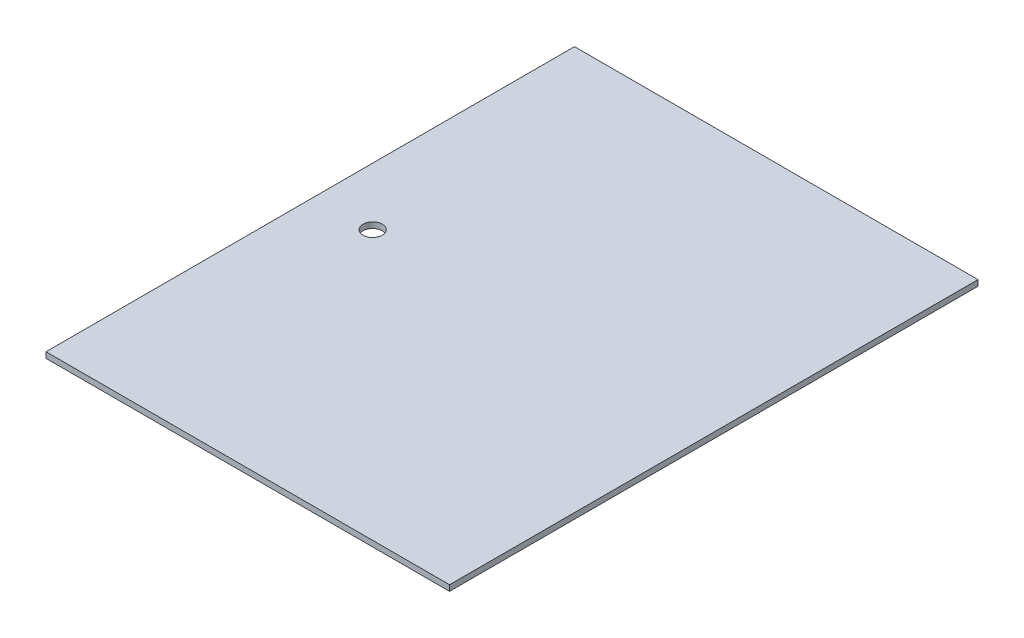
ISO-10303-21;
HEADER;
FILE_DESCRIPTION(('STEP AP214'),'2;1');
FILE_NAME('part.step','',(''),(''),'','','');
FILE_SCHEMA(('AUTOMOTIVE_DESIGN { 1 0 10303 214 1 1 1 1 }'));
ENDSEC;
DATA;
#1=APPLICATION_CONTEXT('core data for automotive mechanical design processes');
#2=APPLICATION_PROTOCOL_DEFINITION('international standard','automotive_design',2000,#1);
#3=PRODUCT_CONTEXT('',#1,'mechanical');
#4=PRODUCT('Part','Part','',(#3));
#5=PRODUCT_RELATED_PRODUCT_CATEGORY('part','',(#4));
#6=PRODUCT_DEFINITION_FORMATION('','',#4);
#7=PRODUCT_DEFINITION_CONTEXT('part definition',#1,'design');
#8=PRODUCT_DEFINITION('design','',#6,#7);
#9=PRODUCT_DEFINITION_SHAPE('','',#8);
#10=(LENGTH_UNIT() NAMED_UNIT(*) SI_UNIT(.MILLI.,.METRE.));
#11=(NAMED_UNIT(*) PLANE_ANGLE_UNIT() SI_UNIT($,.RADIAN.));
#12=(NAMED_UNIT(*) SI_UNIT($,.STERADIAN.) SOLID_ANGLE_UNIT());
#13=UNCERTAINTY_MEASURE_WITH_UNIT(LENGTH_MEASURE(1.E-05),#10,'distance_accuracy_value','');
#14=(GEOMETRIC_REPRESENTATION_CONTEXT(3) GLOBAL_UNCERTAINTY_ASSIGNED_CONTEXT((#13)) GLOBAL_UNIT_ASSIGNED_CONTEXT((#10,
#11,#12)) REPRESENTATION_CONTEXT('',''));
#15=CARTESIAN_POINT('',(0.,0.,0.));
#16=DIRECTION('',(0.,0.,1.));
#17=DIRECTION('',(1.,0.,0.));
#18=AXIS2_PLACEMENT_3D('',#15,#16,#17);
#19=CARTESIAN_POINT('',(-74.7122316133509,3.,-199.478610643544));
#20=DIRECTION('',(1.,0.,0.));
#21=DIRECTION('',(0.,0.,-1.));
#22=AXIS2_PLACEMENT_3D('',#19,#20,#21);
#23=PLANE('',#22);
#24=DIRECTION('',(0.,0.,1.));
#25=VECTOR('',#24,1.);
#26=CARTESIAN_POINT('',(-74.7122316133509,0.,-199.478610643544));
#27=LINE('',#26,#25);
#28=CARTESIAN_POINT('',(-74.7122316133509,0.,-199.478610643544));
#29=VERTEX_POINT('',#28);
#30=CARTESIAN_POINT('',(-74.7122316133508,0.,75.5213893564557));
#31=VERTEX_POINT('',#30);
#32=EDGE_CURVE('E96',#29,#31,#27,.T.);
#33=ORIENTED_EDGE('',*,*,#32,.T.);
#34=DIRECTION('',(0.,-1.,0.));
#35=VECTOR('',#34,1.);
#36=CARTESIAN_POINT('',(-74.7122316133508,3.,75.5213893564557));
#37=LINE('',#36,#35);
#38=CARTESIAN_POINT('',(-74.7122316133508,3.,75.5213893564557));
#39=VERTEX_POINT('',#38);
#40=EDGE_CURVE('E11',#39,#31,#37,.T.);
#41=ORIENTED_EDGE('',*,*,#40,.F.);
#42=DIRECTION('',(0.,0.,1.));
#43=VECTOR('',#42,1.);
#44=CARTESIAN_POINT('',(-74.7122316133509,3.,-199.478610643544));
#45=LINE('',#44,#43);
#46=CARTESIAN_POINT('',(-74.7122316133509,3.,-199.478610643544));
#47=VERTEX_POINT('',#46);
#48=EDGE_CURVE('E84',#47,#39,#45,.T.);
#49=ORIENTED_EDGE('',*,*,#48,.F.);
#50=DIRECTION('',(0.,-1.,0.));
#51=VECTOR('',#50,1.);
#52=CARTESIAN_POINT('',(-74.7122316133509,3.,-199.478610643544));
#53=LINE('',#52,#51);
#54=EDGE_CURVE('E92',#47,#29,#53,.T.);
#55=ORIENTED_EDGE('',*,*,#54,.T.);
#56=EDGE_LOOP('',(#33,#41,#49,#55));
#57=FACE_BOUND('',#56,.T.);
#58=ADVANCED_FACE('F33',(#57),#23,.F.);
#59=CARTESIAN_POINT('',(-74.7122316133508,3.,75.5213893564557));
#60=DIRECTION('',(0.,0.,-1.));
#61=DIRECTION('',(-1.,0.,0.));
#62=AXIS2_PLACEMENT_3D('',#59,#60,#61);
#63=PLANE('',#62);
#64=DIRECTION('',(1.,0.,0.));
#65=VECTOR('',#64,1.);
#66=CARTESIAN_POINT('',(-74.7122316133508,0.,75.5213893564557));
#67=LINE('',#66,#65);
#68=CARTESIAN_POINT('',(135.287768386649,0.,75.5213893564557));
#69=VERTEX_POINT('',#68);
#70=EDGE_CURVE('E88',#31,#69,#67,.T.);
#71=ORIENTED_EDGE('',*,*,#70,.T.);
#72=DIRECTION('',(0.,-1.,0.));
#73=VECTOR('',#72,1.);
#74=CARTESIAN_POINT('',(135.287768386649,3.,75.5213893564557));
#75=LINE('',#74,#73);
#76=CARTESIAN_POINT('',(135.287768386649,3.,75.5213893564557));
#77=VERTEX_POINT('',#76);
#78=EDGE_CURVE('E41',#77,#69,#75,.T.);
#79=ORIENTED_EDGE('',*,*,#78,.F.);
#80=DIRECTION('',(1.,0.,0.));
#81=VECTOR('',#80,1.);
#82=CARTESIAN_POINT('',(-74.7122316133508,3.,75.5213893564557));
#83=LINE('',#82,#81);
#84=EDGE_CURVE('E79',#39,#77,#83,.T.);
#85=ORIENTED_EDGE('',*,*,#84,.F.);
#86=ORIENTED_EDGE('',*,*,#40,.T.);
#87=EDGE_LOOP('',(#71,#79,#85,#86));
#88=FACE_BOUND('',#87,.T.);
#89=ADVANCED_FACE('F87',(#88),#63,.F.);
#90=CARTESIAN_POINT('',(135.287768386649,3.,-199.478610643544));
#91=DIRECTION('',(-1.,0.,0.));
#92=DIRECTION('',(0.,0.,1.));
#93=AXIS2_PLACEMENT_3D('',#90,#91,#92);
#94=PLANE('',#93);
#95=DIRECTION('',(0.,0.,-1.));
#96=VECTOR('',#95,1.);
#97=CARTESIAN_POINT('',(135.287768386649,0.,-199.478610643544));
#98=LINE('',#97,#96);
#99=CARTESIAN_POINT('',(135.287768386649,0.,-199.478610643544));
#100=VERTEX_POINT('',#99);
#101=EDGE_CURVE('E66',#69,#100,#98,.T.);
#102=ORIENTED_EDGE('',*,*,#101,.T.);
#103=DIRECTION('',(0.,-1.,0.));
#104=VECTOR('',#103,1.);
#105=CARTESIAN_POINT('',(135.287768386649,3.,-199.478610643544));
#106=LINE('',#105,#104);
#107=CARTESIAN_POINT('',(135.287768386649,3.,-199.478610643544));
#108=VERTEX_POINT('',#107);
#109=EDGE_CURVE('E89',#108,#100,#106,.T.);
#110=ORIENTED_EDGE('',*,*,#109,.F.);
#111=DIRECTION('',(0.,0.,-1.));
#112=VECTOR('',#111,1.);
#113=CARTESIAN_POINT('',(135.287768386649,3.,-199.478610643544));
#114=LINE('',#113,#112);
#115=EDGE_CURVE('E82',#77,#108,#114,.T.);
#116=ORIENTED_EDGE('',*,*,#115,.F.);
#117=ORIENTED_EDGE('',*,*,#78,.T.);
#118=EDGE_LOOP('',(#102,#110,#116,#117));
#119=FACE_BOUND('',#118,.T.);
#120=ADVANCED_FACE('F90',(#119),#94,.F.);
#121=CARTESIAN_POINT('',(-74.7122316133509,3.,-199.478610643544));
#122=DIRECTION('',(0.,0.,1.));
#123=DIRECTION('',(1.,0.,0.));
#124=AXIS2_PLACEMENT_3D('',#121,#122,#123);
#125=PLANE('',#124);
#126=DIRECTION('',(-1.,0.,0.));
#127=VECTOR('',#126,1.);
#128=CARTESIAN_POINT('',(-74.7122316133509,0.,-199.478610643544));
#129=LINE('',#128,#127);
#130=EDGE_CURVE('E72',#100,#29,#129,.T.);
#131=ORIENTED_EDGE('',*,*,#130,.T.);
#132=ORIENTED_EDGE('',*,*,#54,.F.);
#133=DIRECTION('',(-1.,0.,0.));
#134=VECTOR('',#133,1.);
#135=CARTESIAN_POINT('',(-74.7122316133509,3.,-199.478610643544));
#136=LINE('',#135,#134);
#137=EDGE_CURVE('E49',#108,#47,#136,.T.);
#138=ORIENTED_EDGE('',*,*,#137,.F.);
#139=ORIENTED_EDGE('',*,*,#109,.T.);
#140=EDGE_LOOP('',(#131,#132,#138,#139));
#141=FACE_BOUND('',#140,.T.);
#142=ADVANCED_FACE('F104',(#141),#125,.F.);
#143=CARTESIAN_POINT('',(0.,3.,0.));
#144=DIRECTION('',(0.,1.,0.));
#145=DIRECTION('',(0.,0.,1.));
#146=AXIS2_PLACEMENT_3D('',#143,#144,#145);
#147=PLANE('',#146);
#148=CARTESIAN_POINT('',(-44.7122316133508,3.,-64.4786106435443));
#149=DIRECTION('',(0.,1.,0.));
#150=DIRECTION('',(0.,0.,1.));
#151=AXIS2_PLACEMENT_3D('',#148,#149,#150);
#152=CIRCLE('',#151,5.);
#153=CARTESIAN_POINT('',(-44.7122316133508,3.,-59.4786106435443));
#154=VERTEX_POINT('',#153);
#155=EDGE_CURVE('E110',#154,#154,#152,.T.);
#156=ORIENTED_EDGE('',*,*,#155,.F.);
#157=EDGE_LOOP('',(#156));
#158=FACE_BOUND('',#157,.T.);
#159=ORIENTED_EDGE('',*,*,#48,.T.);
#160=ORIENTED_EDGE('',*,*,#84,.T.);
#161=ORIENTED_EDGE('',*,*,#115,.T.);
#162=ORIENTED_EDGE('',*,*,#137,.T.);
#163=EDGE_LOOP('',(#159,#160,#161,#162));
#164=FACE_BOUND('',#163,.T.);
#165=ADVANCED_FACE('F80',(#158,#164),#147,.T.);
#166=CARTESIAN_POINT('',(0.,0.,0.));
#167=DIRECTION('',(0.,1.,0.));
#168=DIRECTION('',(0.,0.,1.));
#169=AXIS2_PLACEMENT_3D('',#166,#167,#168);
#170=PLANE('',#169);
#171=CARTESIAN_POINT('',(-44.7122316133508,0.,-64.4786106435443));
#172=DIRECTION('',(0.,1.,0.));
#173=DIRECTION('',(0.,0.,1.));
#174=AXIS2_PLACEMENT_3D('',#171,#172,#173);
#175=CIRCLE('',#174,5.);
#176=CARTESIAN_POINT('',(-44.7122316133508,0.,-59.4786106435443));
#177=VERTEX_POINT('',#176);
#178=EDGE_CURVE('E99',#177,#177,#175,.T.);
#179=ORIENTED_EDGE('',*,*,#178,.T.);
#180=EDGE_LOOP('',(#179));
#181=FACE_BOUND('',#180,.T.);
#182=ORIENTED_EDGE('',*,*,#32,.F.);
#183=ORIENTED_EDGE('',*,*,#130,.F.);
#184=ORIENTED_EDGE('',*,*,#101,.F.);
#185=ORIENTED_EDGE('',*,*,#70,.F.);
#186=EDGE_LOOP('',(#182,#183,#184,#185));
#187=FACE_BOUND('',#186,.T.);
#188=ADVANCED_FACE('F107',(#181,#187),#170,.F.);
#189=CARTESIAN_POINT('',(-44.7122316133508,0.,-64.4786106435443));
#190=DIRECTION('',(0.,1.,0.));
#191=DIRECTION('',(0.,0.,1.));
#192=AXIS2_PLACEMENT_3D('',#189,#190,#191);
#193=CYLINDRICAL_SURFACE('',#192,5.);
#194=ORIENTED_EDGE('',*,*,#178,.F.);
#195=EDGE_LOOP('',(#194));
#196=FACE_BOUND('',#195,.T.);
#197=ORIENTED_EDGE('',*,*,#155,.T.);
#198=EDGE_LOOP('',(#197));
#199=FACE_BOUND('',#198,.T.);
#200=ADVANCED_FACE('F117',(#196,#199),#193,.F.);
#201=CLOSED_SHELL('',(#58,#89,#120,#142,#165,#188,#200));
#202=MANIFOLD_SOLID_BREP('B2',#201);
#203=ADVANCED_BREP_SHAPE_REPRESENTATION('',(#18,#202),#14);
#204=SHAPE_DEFINITION_REPRESENTATION(#9,#203);
ENDSEC;
END-ISO-10303-21;
